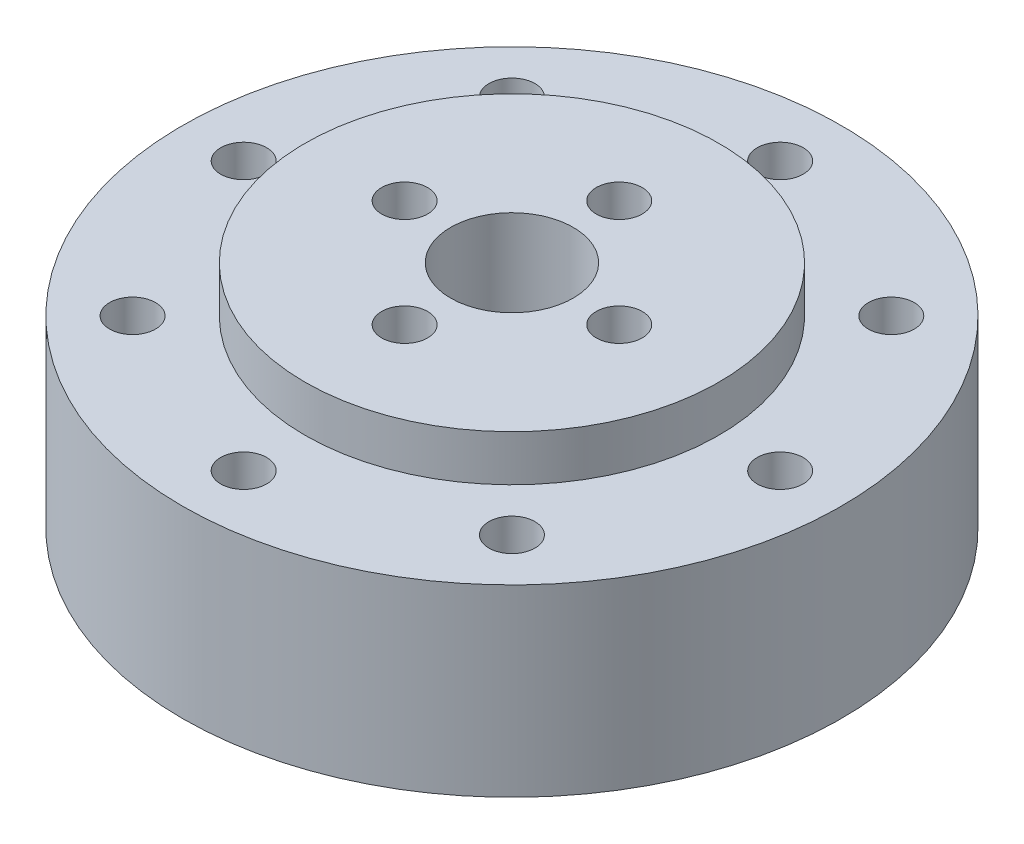
ISO-10303-21;
HEADER;
FILE_DESCRIPTION(('STEP AP214'),'2;1');
FILE_NAME('part.step','',(''),(''),'','','');
FILE_SCHEMA(('AUTOMOTIVE_DESIGN { 1 0 10303 214 1 1 1 1 }'));
ENDSEC;
DATA;
#1=APPLICATION_CONTEXT('core data for automotive mechanical design processes');
#2=APPLICATION_PROTOCOL_DEFINITION('international standard','automotive_design',2000,#1);
#3=PRODUCT_CONTEXT('',#1,'mechanical');
#4=PRODUCT('Part','Part','',(#3));
#5=PRODUCT_RELATED_PRODUCT_CATEGORY('part','',(#4));
#6=PRODUCT_DEFINITION_FORMATION('','',#4);
#7=PRODUCT_DEFINITION_CONTEXT('part definition',#1,'design');
#8=PRODUCT_DEFINITION('design','',#6,#7);
#9=PRODUCT_DEFINITION_SHAPE('','',#8);
#10=(LENGTH_UNIT() NAMED_UNIT(*) SI_UNIT(.MILLI.,.METRE.));
#11=(NAMED_UNIT(*) PLANE_ANGLE_UNIT() SI_UNIT($,.RADIAN.));
#12=(NAMED_UNIT(*) SI_UNIT($,.STERADIAN.) SOLID_ANGLE_UNIT());
#13=UNCERTAINTY_MEASURE_WITH_UNIT(LENGTH_MEASURE(1.E-05),#10,'distance_accuracy_value','');
#14=(GEOMETRIC_REPRESENTATION_CONTEXT(3) GLOBAL_UNCERTAINTY_ASSIGNED_CONTEXT((#13)) GLOBAL_UNIT_ASSIGNED_CONTEXT((#10,
#11,#12)) REPRESENTATION_CONTEXT('',''));
#15=CARTESIAN_POINT('',(0.,0.,0.));
#16=DIRECTION('',(0.,0.,1.));
#17=DIRECTION('',(1.,0.,0.));
#18=AXIS2_PLACEMENT_3D('',#15,#16,#17);
#19=CARTESIAN_POINT('',(0.,12.,0.));
#20=DIRECTION('',(0.,1.,0.));
#21=DIRECTION('',(0.,0.,1.));
#22=AXIS2_PLACEMENT_3D('',#19,#20,#21);
#23=PLANE('',#22);
#24=CARTESIAN_POINT('',(-17.5,12.,0.));
#25=DIRECTION('',(0.,1.,0.));
#26=DIRECTION('',(0.,0.,1.));
#27=AXIS2_PLACEMENT_3D('',#24,#25,#26);
#28=CIRCLE('',#27,1.49999999999999);
#29=CARTESIAN_POINT('',(-17.5,12.,1.49999999999993));
#30=VERTEX_POINT('',#29);
#31=EDGE_CURVE('E245',#30,#30,#28,.F.);
#32=ORIENTED_EDGE('',*,*,#31,.T.);
#33=EDGE_LOOP('',(#32));
#34=FACE_BOUND('',#33,.T.);
#35=CARTESIAN_POINT('',(-12.3743686707646,12.,12.3743686707646));
#36=DIRECTION('',(0.,1.,0.));
#37=DIRECTION('',(0.,0.,1.));
#38=AXIS2_PLACEMENT_3D('',#35,#36,#37);
#39=CIRCLE('',#38,1.5);
#40=CARTESIAN_POINT('',(-12.3743686707646,12.,13.8743686707646));
#41=VERTEX_POINT('',#40);
#42=EDGE_CURVE('E262',#41,#41,#39,.F.);
#43=ORIENTED_EDGE('',*,*,#42,.T.);
#44=EDGE_LOOP('',(#43));
#45=FACE_BOUND('',#44,.T.);
#46=CARTESIAN_POINT('',(12.3743686707646,12.,-12.3743686707646));
#47=DIRECTION('',(0.,1.,0.));
#48=DIRECTION('',(0.,0.,1.));
#49=AXIS2_PLACEMENT_3D('',#46,#47,#48);
#50=CIRCLE('',#49,1.5);
#51=CARTESIAN_POINT('',(12.3743686707646,12.,-10.8743686707646));
#52=VERTEX_POINT('',#51);
#53=EDGE_CURVE('E260',#52,#52,#50,.F.);
#54=ORIENTED_EDGE('',*,*,#53,.T.);
#55=EDGE_LOOP('',(#54));
#56=FACE_BOUND('',#55,.T.);
#57=CARTESIAN_POINT('',(-12.3743686707646,12.,-12.3743686707646));
#58=DIRECTION('',(0.,1.,0.));
#59=DIRECTION('',(0.,0.,1.));
#60=AXIS2_PLACEMENT_3D('',#57,#58,#59);
#61=CIRCLE('',#60,1.5);
#62=CARTESIAN_POINT('',(-12.3743686707646,12.,-10.8743686707646));
#63=VERTEX_POINT('',#62);
#64=EDGE_CURVE('E263',#63,#63,#61,.F.);
#65=ORIENTED_EDGE('',*,*,#64,.T.);
#66=EDGE_LOOP('',(#65));
#67=FACE_BOUND('',#66,.T.);
#68=CARTESIAN_POINT('',(0.,12.,-17.5));
#69=DIRECTION('',(0.,1.,0.));
#70=DIRECTION('',(0.,0.,1.));
#71=AXIS2_PLACEMENT_3D('',#68,#69,#70);
#72=CIRCLE('',#71,1.5);
#73=CARTESIAN_POINT('',(0.,12.,-16.));
#74=VERTEX_POINT('',#73);
#75=EDGE_CURVE('E268',#74,#74,#72,.F.);
#76=ORIENTED_EDGE('',*,*,#75,.T.);
#77=EDGE_LOOP('',(#76));
#78=FACE_BOUND('',#77,.T.);
#79=CARTESIAN_POINT('',(0.,12.,17.5));
#80=DIRECTION('',(0.,1.,0.));
#81=DIRECTION('',(0.,0.,1.));
#82=AXIS2_PLACEMENT_3D('',#79,#80,#81);
#83=CIRCLE('',#82,1.5);
#84=CARTESIAN_POINT('',(0.,12.,19.));
#85=VERTEX_POINT('',#84);
#86=EDGE_CURVE('E500',#85,#85,#83,.F.);
#87=ORIENTED_EDGE('',*,*,#86,.T.);
#88=EDGE_LOOP('',(#87));
#89=FACE_BOUND('',#88,.T.);
#90=CARTESIAN_POINT('',(12.3743686707646,12.,12.3743686707646));
#91=DIRECTION('',(0.,1.,0.));
#92=DIRECTION('',(0.,0.,1.));
#93=AXIS2_PLACEMENT_3D('',#90,#91,#92);
#94=CIRCLE('',#93,1.5);
#95=CARTESIAN_POINT('',(12.3743686707646,12.,13.8743686707646));
#96=VERTEX_POINT('',#95);
#97=EDGE_CURVE('E497',#96,#96,#94,.F.);
#98=ORIENTED_EDGE('',*,*,#97,.T.);
#99=EDGE_LOOP('',(#98));
#100=FACE_BOUND('',#99,.T.);
#101=CARTESIAN_POINT('',(0.,12.,0.));
#102=DIRECTION('',(0.,1.,0.));
#103=DIRECTION('',(0.,0.,1.));
#104=AXIS2_PLACEMENT_3D('',#101,#102,#103);
#105=CIRCLE('',#104,21.5);
#106=CARTESIAN_POINT('',(0.,12.,21.5));
#107=VERTEX_POINT('',#106);
#108=EDGE_CURVE('E494',#107,#107,#105,.T.);
#109=ORIENTED_EDGE('',*,*,#108,.T.);
#110=EDGE_LOOP('',(#109));
#111=FACE_BOUND('',#110,.T.);
#112=CARTESIAN_POINT('',(17.5,12.,0.));
#113=DIRECTION('',(0.,1.,0.));
#114=DIRECTION('',(0.,0.,1.));
#115=AXIS2_PLACEMENT_3D('',#112,#113,#114);
#116=CIRCLE('',#115,1.5);
#117=CARTESIAN_POINT('',(17.5,12.,1.5));
#118=VERTEX_POINT('',#117);
#119=EDGE_CURVE('E290',#118,#118,#116,.F.);
#120=ORIENTED_EDGE('',*,*,#119,.T.);
#121=EDGE_LOOP('',(#120));
#122=FACE_BOUND('',#121,.T.);
#123=CARTESIAN_POINT('',(0.,12.,0.));
#124=DIRECTION('',(0.,1.,0.));
#125=DIRECTION('',(0.,0.,1.));
#126=AXIS2_PLACEMENT_3D('',#123,#124,#125);
#127=CIRCLE('',#126,13.5);
#128=CARTESIAN_POINT('',(0.,12.,13.5));
#129=VERTEX_POINT('',#128);
#130=EDGE_CURVE('E488',#129,#129,#127,.T.);
#131=ORIENTED_EDGE('',*,*,#130,.F.);
#132=EDGE_LOOP('',(#131));
#133=FACE_BOUND('',#132,.T.);
#134=ADVANCED_FACE('F43',(#34,#45,#56,#67,#78,#89,#100,#111,#122,#133),#23,.T.);
#135=CARTESIAN_POINT('',(0.,0.,0.));
#136=DIRECTION('',(0.,1.,0.));
#137=DIRECTION('',(0.,0.,1.));
#138=AXIS2_PLACEMENT_3D('',#135,#136,#137);
#139=PLANE('',#138);
#140=CARTESIAN_POINT('',(0.,0.,0.));
#141=DIRECTION('',(0.,1.,0.));
#142=DIRECTION('',(0.,0.,1.));
#143=AXIS2_PLACEMENT_3D('',#140,#141,#142);
#144=CIRCLE('',#143,21.5);
#145=CARTESIAN_POINT('',(0.,0.,21.5));
#146=VERTEX_POINT('',#145);
#147=EDGE_CURVE('E11',#146,#146,#144,.T.);
#148=ORIENTED_EDGE('',*,*,#147,.F.);
#149=EDGE_LOOP('',(#148));
#150=FACE_BOUND('',#149,.T.);
#151=CARTESIAN_POINT('',(12.3743686707646,0.,-12.3743686707646));
#152=DIRECTION('',(0.,1.,0.));
#153=DIRECTION('',(0.,0.,1.));
#154=AXIS2_PLACEMENT_3D('',#151,#152,#153);
#155=CIRCLE('',#154,1.5);
#156=CARTESIAN_POINT('',(12.3743686707646,0.,-10.8743686707646));
#157=VERTEX_POINT('',#156);
#158=EDGE_CURVE('E52',#157,#157,#155,.T.);
#159=ORIENTED_EDGE('',*,*,#158,.T.);
#160=EDGE_LOOP('',(#159));
#161=FACE_BOUND('',#160,.T.);
#162=CARTESIAN_POINT('',(0.,0.,0.));
#163=DIRECTION('',(0.,1.,0.));
#164=DIRECTION('',(0.,0.,1.));
#165=AXIS2_PLACEMENT_3D('',#162,#163,#164);
#166=CIRCLE('',#165,10.);
#167=CARTESIAN_POINT('',(0.,0.,10.));
#168=VERTEX_POINT('',#167);
#169=EDGE_CURVE('E242',#168,#168,#166,.T.);
#170=ORIENTED_EDGE('',*,*,#169,.T.);
#171=EDGE_LOOP('',(#170));
#172=FACE_BOUND('',#171,.T.);
#173=CARTESIAN_POINT('',(12.3743686707646,0.,12.3743686707646));
#174=DIRECTION('',(0.,1.,0.));
#175=DIRECTION('',(0.,0.,-1.));
#176=AXIS2_PLACEMENT_3D('',#173,#174,#175);
#177=CIRCLE('',#176,1.5);
#178=CARTESIAN_POINT('',(12.3743686707646,0.,10.8743686707646));
#179=VERTEX_POINT('',#178);
#180=EDGE_CURVE('E239',#179,#179,#177,.T.);
#181=ORIENTED_EDGE('',*,*,#180,.T.);
#182=EDGE_LOOP('',(#181));
#183=FACE_BOUND('',#182,.T.);
#184=CARTESIAN_POINT('',(-12.3743686707646,0.,12.3743686707646));
#185=DIRECTION('',(0.,1.,0.));
#186=DIRECTION('',(0.,0.,1.));
#187=AXIS2_PLACEMENT_3D('',#184,#185,#186);
#188=CIRCLE('',#187,1.5);
#189=CARTESIAN_POINT('',(-12.3743686707646,0.,13.8743686707646));
#190=VERTEX_POINT('',#189);
#191=EDGE_CURVE('E236',#190,#190,#188,.T.);
#192=ORIENTED_EDGE('',*,*,#191,.T.);
#193=EDGE_LOOP('',(#192));
#194=FACE_BOUND('',#193,.T.);
#195=CARTESIAN_POINT('',(-12.3743686707646,0.,-12.3743686707646));
#196=DIRECTION('',(0.,1.,0.));
#197=DIRECTION('',(0.,0.,-1.));
#198=AXIS2_PLACEMENT_3D('',#195,#196,#197);
#199=CIRCLE('',#198,1.5);
#200=CARTESIAN_POINT('',(-12.3743686707646,0.,-13.8743686707646));
#201=VERTEX_POINT('',#200);
#202=EDGE_CURVE('E233',#201,#201,#199,.T.);
#203=ORIENTED_EDGE('',*,*,#202,.T.);
#204=EDGE_LOOP('',(#203));
#205=FACE_BOUND('',#204,.T.);
#206=CARTESIAN_POINT('',(17.5,0.,0.));
#207=DIRECTION('',(0.,1.,0.));
#208=DIRECTION('',(0.,0.,1.));
#209=AXIS2_PLACEMENT_3D('',#206,#207,#208);
#210=CIRCLE('',#209,1.5);
#211=CARTESIAN_POINT('',(17.5,0.,1.5));
#212=VERTEX_POINT('',#211);
#213=EDGE_CURVE('E230',#212,#212,#210,.T.);
#214=ORIENTED_EDGE('',*,*,#213,.T.);
#215=EDGE_LOOP('',(#214));
#216=FACE_BOUND('',#215,.T.);
#217=CARTESIAN_POINT('',(0.,0.,17.5));
#218=DIRECTION('',(0.,1.,0.));
#219=DIRECTION('',(0.,0.,-1.));
#220=AXIS2_PLACEMENT_3D('',#217,#218,#219);
#221=CIRCLE('',#220,1.5);
#222=CARTESIAN_POINT('',(0.,0.,16.));
#223=VERTEX_POINT('',#222);
#224=EDGE_CURVE('E227',#223,#223,#221,.T.);
#225=ORIENTED_EDGE('',*,*,#224,.T.);
#226=EDGE_LOOP('',(#225));
#227=FACE_BOUND('',#226,.T.);
#228=CARTESIAN_POINT('',(-17.5,0.,0.));
#229=DIRECTION('',(0.,1.,0.));
#230=DIRECTION('',(0.,0.,1.));
#231=AXIS2_PLACEMENT_3D('',#228,#229,#230);
#232=CIRCLE('',#231,1.49999999999999);
#233=CARTESIAN_POINT('',(-17.5,0.,1.49999999999993));
#234=VERTEX_POINT('',#233);
#235=EDGE_CURVE('E224',#234,#234,#232,.T.);
#236=ORIENTED_EDGE('',*,*,#235,.T.);
#237=EDGE_LOOP('',(#236));
#238=FACE_BOUND('',#237,.T.);
#239=CARTESIAN_POINT('',(0.,0.,-17.5));
#240=DIRECTION('',(0.,1.,0.));
#241=DIRECTION('',(0.,0.,-1.));
#242=AXIS2_PLACEMENT_3D('',#239,#240,#241);
#243=CIRCLE('',#242,1.5);
#244=CARTESIAN_POINT('',(0.,0.,-19.));
#245=VERTEX_POINT('',#244);
#246=EDGE_CURVE('E221',#245,#245,#243,.T.);
#247=ORIENTED_EDGE('',*,*,#246,.T.);
#248=EDGE_LOOP('',(#247));
#249=FACE_BOUND('',#248,.T.);
#250=ADVANCED_FACE('F250',(#150,#161,#172,#183,#194,#205,#216,#227,#238,#249),#139,.F.);
#251=CARTESIAN_POINT('',(0.,9.,0.));
#252=DIRECTION('',(0.,-1.,0.));
#253=DIRECTION('',(0.,0.,-1.));
#254=AXIS2_PLACEMENT_3D('',#251,#252,#253);
#255=CYLINDRICAL_SURFACE('',#254,21.5);
#256=ORIENTED_EDGE('',*,*,#147,.T.);
#257=EDGE_LOOP('',(#256));
#258=FACE_BOUND('',#257,.T.);
#259=ORIENTED_EDGE('',*,*,#108,.F.);
#260=EDGE_LOOP('',(#259));
#261=FACE_BOUND('',#260,.T.);
#262=ADVANCED_FACE('F45',(#258,#261),#255,.T.);
#263=CARTESIAN_POINT('',(12.3743686707646,9.,-12.3743686707646));
#264=DIRECTION('',(0.,-1.,0.));
#265=DIRECTION('',(0.,0.,-1.));
#266=AXIS2_PLACEMENT_3D('',#263,#264,#265);
#267=CYLINDRICAL_SURFACE('',#266,1.5);
#268=ORIENTED_EDGE('',*,*,#158,.F.);
#269=EDGE_LOOP('',(#268));
#270=FACE_BOUND('',#269,.T.);
#271=ORIENTED_EDGE('',*,*,#53,.F.);
#272=EDGE_LOOP('',(#271));
#273=FACE_BOUND('',#272,.T.);
#274=ADVANCED_FACE('F253',(#270,#273),#267,.F.);
#275=CARTESIAN_POINT('',(0.,9.,0.));
#276=DIRECTION('',(0.,-1.,0.));
#277=DIRECTION('',(0.,0.,-1.));
#278=AXIS2_PLACEMENT_3D('',#275,#276,#277);
#279=CYLINDRICAL_SURFACE('',#278,10.);
#280=CARTESIAN_POINT('',(0.,9.,0.));
#281=DIRECTION('',(0.,1.,0.));
#282=DIRECTION('',(0.,0.,1.));
#283=AXIS2_PLACEMENT_3D('',#280,#281,#282);
#284=CIRCLE('',#283,10.);
#285=CARTESIAN_POINT('',(0.,9.,10.));
#286=VERTEX_POINT('',#285);
#287=EDGE_CURVE('E188',#286,#286,#284,.T.);
#288=ORIENTED_EDGE('',*,*,#287,.T.);
#289=EDGE_LOOP('',(#288));
#290=FACE_BOUND('',#289,.T.);
#291=ORIENTED_EDGE('',*,*,#169,.F.);
#292=EDGE_LOOP('',(#291));
#293=FACE_BOUND('',#292,.T.);
#294=ADVANCED_FACE('F256',(#290,#293),#279,.F.);
#295=CARTESIAN_POINT('',(12.3743686707646,9.,12.3743686707646));
#296=DIRECTION('',(0.,-1.,0.));
#297=DIRECTION('',(0.,0.,-1.));
#298=AXIS2_PLACEMENT_3D('',#295,#296,#297);
#299=CYLINDRICAL_SURFACE('',#298,1.5);
#300=ORIENTED_EDGE('',*,*,#180,.F.);
#301=EDGE_LOOP('',(#300));
#302=FACE_BOUND('',#301,.T.);
#303=ORIENTED_EDGE('',*,*,#97,.F.);
#304=EDGE_LOOP('',(#303));
#305=FACE_BOUND('',#304,.T.);
#306=ADVANCED_FACE('F538',(#302,#305),#299,.F.);
#307=CARTESIAN_POINT('',(-12.3743686707646,9.,12.3743686707646));
#308=DIRECTION('',(0.,-1.,0.));
#309=DIRECTION('',(0.,0.,-1.));
#310=AXIS2_PLACEMENT_3D('',#307,#308,#309);
#311=CYLINDRICAL_SURFACE('',#310,1.5);
#312=ORIENTED_EDGE('',*,*,#191,.F.);
#313=EDGE_LOOP('',(#312));
#314=FACE_BOUND('',#313,.T.);
#315=ORIENTED_EDGE('',*,*,#42,.F.);
#316=EDGE_LOOP('',(#315));
#317=FACE_BOUND('',#316,.T.);
#318=ADVANCED_FACE('F530',(#314,#317),#311,.F.);
#319=CARTESIAN_POINT('',(-12.3743686707646,9.,-12.3743686707646));
#320=DIRECTION('',(0.,-1.,0.));
#321=DIRECTION('',(0.,0.,-1.));
#322=AXIS2_PLACEMENT_3D('',#319,#320,#321);
#323=CYLINDRICAL_SURFACE('',#322,1.5);
#324=ORIENTED_EDGE('',*,*,#202,.F.);
#325=EDGE_LOOP('',(#324));
#326=FACE_BOUND('',#325,.T.);
#327=ORIENTED_EDGE('',*,*,#64,.F.);
#328=EDGE_LOOP('',(#327));
#329=FACE_BOUND('',#328,.T.);
#330=ADVANCED_FACE('F521',(#326,#329),#323,.F.);
#331=CARTESIAN_POINT('',(17.5,9.,0.));
#332=DIRECTION('',(0.,-1.,0.));
#333=DIRECTION('',(0.,0.,-1.));
#334=AXIS2_PLACEMENT_3D('',#331,#332,#333);
#335=CYLINDRICAL_SURFACE('',#334,1.5);
#336=ORIENTED_EDGE('',*,*,#213,.F.);
#337=EDGE_LOOP('',(#336));
#338=FACE_BOUND('',#337,.T.);
#339=ORIENTED_EDGE('',*,*,#119,.F.);
#340=EDGE_LOOP('',(#339));
#341=FACE_BOUND('',#340,.T.);
#342=ADVANCED_FACE('F518',(#338,#341),#335,.F.);
#343=CARTESIAN_POINT('',(0.,9.,17.5));
#344=DIRECTION('',(0.,-1.,0.));
#345=DIRECTION('',(0.,0.,-1.));
#346=AXIS2_PLACEMENT_3D('',#343,#344,#345);
#347=CYLINDRICAL_SURFACE('',#346,1.5);
#348=ORIENTED_EDGE('',*,*,#224,.F.);
#349=EDGE_LOOP('',(#348));
#350=FACE_BOUND('',#349,.T.);
#351=ORIENTED_EDGE('',*,*,#86,.F.);
#352=EDGE_LOOP('',(#351));
#353=FACE_BOUND('',#352,.T.);
#354=ADVANCED_FACE('F520',(#350,#353),#347,.F.);
#355=CARTESIAN_POINT('',(-17.5,9.,0.));
#356=DIRECTION('',(0.,-1.,0.));
#357=DIRECTION('',(0.,0.,-1.));
#358=AXIS2_PLACEMENT_3D('',#355,#356,#357);
#359=CYLINDRICAL_SURFACE('',#358,1.49999999999999);
#360=ORIENTED_EDGE('',*,*,#235,.F.);
#361=EDGE_LOOP('',(#360));
#362=FACE_BOUND('',#361,.T.);
#363=ORIENTED_EDGE('',*,*,#31,.F.);
#364=EDGE_LOOP('',(#363));
#365=FACE_BOUND('',#364,.T.);
#366=ADVANCED_FACE('F434',(#362,#365),#359,.F.);
#367=CARTESIAN_POINT('',(0.,9.,-17.5));
#368=DIRECTION('',(0.,-1.,0.));
#369=DIRECTION('',(0.,0.,-1.));
#370=AXIS2_PLACEMENT_3D('',#367,#368,#369);
#371=CYLINDRICAL_SURFACE('',#370,1.5);
#372=ORIENTED_EDGE('',*,*,#246,.F.);
#373=EDGE_LOOP('',(#372));
#374=FACE_BOUND('',#373,.T.);
#375=ORIENTED_EDGE('',*,*,#75,.F.);
#376=EDGE_LOOP('',(#375));
#377=FACE_BOUND('',#376,.T.);
#378=ADVANCED_FACE('F425',(#374,#377),#371,.F.);
#379=CARTESIAN_POINT('',(0.,9.,0.));
#380=DIRECTION('',(0.,1.,0.));
#381=DIRECTION('',(0.,0.,1.));
#382=AXIS2_PLACEMENT_3D('',#379,#380,#381);
#383=PLANE('',#382);
#384=CARTESIAN_POINT('',(-7.,9.,0.));
#385=DIRECTION('',(0.,1.,0.));
#386=DIRECTION('',(0.,0.,1.));
#387=AXIS2_PLACEMENT_3D('',#384,#385,#386);
#388=CIRCLE('',#387,1.5);
#389=CARTESIAN_POINT('',(-7.,9.,1.5));
#390=VERTEX_POINT('',#389);
#391=EDGE_CURVE('E287',#390,#390,#388,.F.);
#392=ORIENTED_EDGE('',*,*,#391,.F.);
#393=EDGE_LOOP('',(#392));
#394=FACE_BOUND('',#393,.T.);
#395=CARTESIAN_POINT('',(0.,9.,-7.));
#396=DIRECTION('',(0.,1.,0.));
#397=DIRECTION('',(0.,0.,1.));
#398=AXIS2_PLACEMENT_3D('',#395,#396,#397);
#399=CIRCLE('',#398,1.5);
#400=CARTESIAN_POINT('',(0.,9.,-5.5));
#401=VERTEX_POINT('',#400);
#402=EDGE_CURVE('E284',#401,#401,#399,.T.);
#403=ORIENTED_EDGE('',*,*,#402,.T.);
#404=EDGE_LOOP('',(#403));
#405=FACE_BOUND('',#404,.T.);
#406=CARTESIAN_POINT('',(7.,9.,0.));
#407=DIRECTION('',(0.,1.,0.));
#408=DIRECTION('',(0.,0.,1.));
#409=AXIS2_PLACEMENT_3D('',#406,#407,#408);
#410=CIRCLE('',#409,1.5);
#411=CARTESIAN_POINT('',(7.,9.,1.5));
#412=VERTEX_POINT('',#411);
#413=EDGE_CURVE('E281',#412,#412,#410,.T.);
#414=ORIENTED_EDGE('',*,*,#413,.T.);
#415=EDGE_LOOP('',(#414));
#416=FACE_BOUND('',#415,.T.);
#417=CARTESIAN_POINT('',(0.,9.,7.));
#418=DIRECTION('',(0.,1.,0.));
#419=DIRECTION('',(0.,0.,1.));
#420=AXIS2_PLACEMENT_3D('',#417,#418,#419);
#421=CIRCLE('',#420,1.5);
#422=CARTESIAN_POINT('',(0.,9.,8.5));
#423=VERTEX_POINT('',#422);
#424=EDGE_CURVE('E277',#423,#423,#421,.F.);
#425=ORIENTED_EDGE('',*,*,#424,.F.);
#426=EDGE_LOOP('',(#425));
#427=FACE_BOUND('',#426,.T.);
#428=CARTESIAN_POINT('',(0.,9.,0.));
#429=DIRECTION('',(0.,1.,0.));
#430=DIRECTION('',(0.,0.,1.));
#431=AXIS2_PLACEMENT_3D('',#428,#429,#430);
#432=CIRCLE('',#431,4.);
#433=CARTESIAN_POINT('',(0.,9.,4.));
#434=VERTEX_POINT('',#433);
#435=EDGE_CURVE('E274',#434,#434,#432,.T.);
#436=ORIENTED_EDGE('',*,*,#435,.T.);
#437=EDGE_LOOP('',(#436));
#438=FACE_BOUND('',#437,.T.);
#439=ORIENTED_EDGE('',*,*,#287,.F.);
#440=EDGE_LOOP('',(#439));
#441=FACE_BOUND('',#440,.T.);
#442=ADVANCED_FACE('F414',(#394,#405,#416,#427,#438,#441),#383,.F.);
#443=CARTESIAN_POINT('',(0.,12.,-7.));
#444=DIRECTION('',(0.,-1.,0.));
#445=DIRECTION('',(0.,0.,-1.));
#446=AXIS2_PLACEMENT_3D('',#443,#444,#445);
#447=CYLINDRICAL_SURFACE('',#446,1.5);
#448=ORIENTED_EDGE('',*,*,#402,.F.);
#449=EDGE_LOOP('',(#448));
#450=FACE_BOUND('',#449,.T.);
#451=CARTESIAN_POINT('',(0.,15.,-7.));
#452=DIRECTION('',(0.,1.,0.));
#453=DIRECTION('',(0.,0.,1.));
#454=AXIS2_PLACEMENT_3D('',#451,#452,#453);
#455=CIRCLE('',#454,1.5);
#456=CARTESIAN_POINT('',(0.,15.,-5.5));
#457=VERTEX_POINT('',#456);
#458=EDGE_CURVE('E480',#457,#457,#455,.T.);
#459=ORIENTED_EDGE('',*,*,#458,.T.);
#460=EDGE_LOOP('',(#459));
#461=FACE_BOUND('',#460,.T.);
#462=ADVANCED_FACE('F424',(#450,#461),#447,.F.);
#463=CARTESIAN_POINT('',(7.,12.,0.));
#464=DIRECTION('',(0.,-1.,0.));
#465=DIRECTION('',(0.,0.,-1.));
#466=AXIS2_PLACEMENT_3D('',#463,#464,#465);
#467=CYLINDRICAL_SURFACE('',#466,1.5);
#468=ORIENTED_EDGE('',*,*,#413,.F.);
#469=EDGE_LOOP('',(#468));
#470=FACE_BOUND('',#469,.T.);
#471=CARTESIAN_POINT('',(7.,15.,0.));
#472=DIRECTION('',(0.,1.,0.));
#473=DIRECTION('',(0.,0.,1.));
#474=AXIS2_PLACEMENT_3D('',#471,#472,#473);
#475=CIRCLE('',#474,1.5);
#476=CARTESIAN_POINT('',(7.,15.,1.5));
#477=VERTEX_POINT('',#476);
#478=EDGE_CURVE('E477',#477,#477,#475,.T.);
#479=ORIENTED_EDGE('',*,*,#478,.T.);
#480=EDGE_LOOP('',(#479));
#481=FACE_BOUND('',#480,.T.);
#482=ADVANCED_FACE('F431',(#470,#481),#467,.F.);
#483=CARTESIAN_POINT('',(0.,12.,7.));
#484=DIRECTION('',(0.,-1.,0.));
#485=DIRECTION('',(0.,0.,-1.));
#486=AXIS2_PLACEMENT_3D('',#483,#484,#485);
#487=CYLINDRICAL_SURFACE('',#486,1.5);
#488=ORIENTED_EDGE('',*,*,#424,.T.);
#489=EDGE_LOOP('',(#488));
#490=FACE_BOUND('',#489,.T.);
#491=CARTESIAN_POINT('',(0.,15.,7.));
#492=DIRECTION('',(0.,1.,0.));
#493=DIRECTION('',(0.,0.,1.));
#494=AXIS2_PLACEMENT_3D('',#491,#492,#493);
#495=CIRCLE('',#494,1.5);
#496=CARTESIAN_POINT('',(0.,15.,8.5));
#497=VERTEX_POINT('',#496);
#498=EDGE_CURVE('E466',#497,#497,#495,.T.);
#499=ORIENTED_EDGE('',*,*,#498,.T.);
#500=EDGE_LOOP('',(#499));
#501=FACE_BOUND('',#500,.T.);
#502=ADVANCED_FACE('F717',(#490,#501),#487,.F.);
#503=CARTESIAN_POINT('',(0.,12.,0.));
#504=DIRECTION('',(0.,-1.,0.));
#505=DIRECTION('',(0.,0.,-1.));
#506=AXIS2_PLACEMENT_3D('',#503,#504,#505);
#507=CYLINDRICAL_SURFACE('',#506,4.);
#508=ORIENTED_EDGE('',*,*,#435,.F.);
#509=EDGE_LOOP('',(#508));
#510=FACE_BOUND('',#509,.T.);
#511=CARTESIAN_POINT('',(0.,15.,0.));
#512=DIRECTION('',(0.,1.,0.));
#513=DIRECTION('',(0.,0.,1.));
#514=AXIS2_PLACEMENT_3D('',#511,#512,#513);
#515=CIRCLE('',#514,4.);
#516=CARTESIAN_POINT('',(0.,15.,4.));
#517=VERTEX_POINT('',#516);
#518=EDGE_CURVE('E462',#517,#517,#515,.T.);
#519=ORIENTED_EDGE('',*,*,#518,.T.);
#520=EDGE_LOOP('',(#519));
#521=FACE_BOUND('',#520,.T.);
#522=ADVANCED_FACE('F457',(#510,#521),#507,.F.);
#523=CARTESIAN_POINT('',(-7.,12.,0.));
#524=DIRECTION('',(0.,-1.,0.));
#525=DIRECTION('',(0.,0.,-1.));
#526=AXIS2_PLACEMENT_3D('',#523,#524,#525);
#527=CYLINDRICAL_SURFACE('',#526,1.5);
#528=ORIENTED_EDGE('',*,*,#391,.T.);
#529=EDGE_LOOP('',(#528));
#530=FACE_BOUND('',#529,.T.);
#531=CARTESIAN_POINT('',(-7.,15.,0.));
#532=DIRECTION('',(0.,1.,0.));
#533=DIRECTION('',(0.,0.,1.));
#534=AXIS2_PLACEMENT_3D('',#531,#532,#533);
#535=CIRCLE('',#534,1.5);
#536=CARTESIAN_POINT('',(-7.,15.,1.5));
#537=VERTEX_POINT('',#536);
#538=EDGE_CURVE('E473',#537,#537,#535,.T.);
#539=ORIENTED_EDGE('',*,*,#538,.T.);
#540=EDGE_LOOP('',(#539));
#541=FACE_BOUND('',#540,.T.);
#542=ADVANCED_FACE('F452',(#530,#541),#527,.F.);
#543=CARTESIAN_POINT('',(0.,15.,0.));
#544=DIRECTION('',(0.,1.,0.));
#545=DIRECTION('',(0.,0.,1.));
#546=AXIS2_PLACEMENT_3D('',#543,#544,#545);
#547=PLANE('',#546);
#548=ORIENTED_EDGE('',*,*,#518,.F.);
#549=EDGE_LOOP('',(#548));
#550=FACE_BOUND('',#549,.T.);
#551=ORIENTED_EDGE('',*,*,#498,.F.);
#552=EDGE_LOOP('',(#551));
#553=FACE_BOUND('',#552,.T.);
#554=CARTESIAN_POINT('',(0.,15.,0.));
#555=DIRECTION('',(0.,1.,0.));
#556=DIRECTION('',(0.,0.,1.));
#557=AXIS2_PLACEMENT_3D('',#554,#555,#556);
#558=CIRCLE('',#557,13.5);
#559=CARTESIAN_POINT('',(0.,15.,13.5));
#560=VERTEX_POINT('',#559);
#561=EDGE_CURVE('E278',#560,#560,#558,.T.);
#562=ORIENTED_EDGE('',*,*,#561,.T.);
#563=EDGE_LOOP('',(#562));
#564=FACE_BOUND('',#563,.T.);
#565=ORIENTED_EDGE('',*,*,#538,.F.);
#566=EDGE_LOOP('',(#565));
#567=FACE_BOUND('',#566,.T.);
#568=ORIENTED_EDGE('',*,*,#478,.F.);
#569=EDGE_LOOP('',(#568));
#570=FACE_BOUND('',#569,.T.);
#571=ORIENTED_EDGE('',*,*,#458,.F.);
#572=EDGE_LOOP('',(#571));
#573=FACE_BOUND('',#572,.T.);
#574=ADVANCED_FACE('F449',(#550,#553,#564,#567,#570,#573),#547,.T.);
#575=CARTESIAN_POINT('',(0.,15.,0.));
#576=DIRECTION('',(0.,-1.,0.));
#577=DIRECTION('',(0.,0.,-1.));
#578=AXIS2_PLACEMENT_3D('',#575,#576,#577);
#579=CYLINDRICAL_SURFACE('',#578,13.5);
#580=ORIENTED_EDGE('',*,*,#561,.F.);
#581=EDGE_LOOP('',(#580));
#582=FACE_BOUND('',#581,.T.);
#583=ORIENTED_EDGE('',*,*,#130,.T.);
#584=EDGE_LOOP('',(#583));
#585=FACE_BOUND('',#584,.T.);
#586=ADVANCED_FACE('F447',(#582,#585),#579,.T.);
#587=CLOSED_SHELL('',(#134,#250,#262,#274,#294,#306,#318,#330,#342,#354,#366,#378,#442,#462,
#482,#502,#522,#542,#574,#586));
#588=CARTESIAN_POINT('',(0.,9.,0.));
#589=DIRECTION('',(0.,1.,0.));
#590=DIRECTION('',(0.,0.,1.));
#591=AXIS2_PLACEMENT_3D('',#588,#589,#590);
#592=CIRCLE('',#591,12.);
#593=CARTESIAN_POINT('',(0.,9.,12.));
#594=VERTEX_POINT('',#593);
#595=EDGE_CURVE('E302',#594,#594,#592,.T.);
#596=ORIENTED_EDGE('',*,*,#595,.T.);
#597=EDGE_LOOP('',(#596));
#598=FACE_BOUND('',#597,.T.);
#599=CARTESIAN_POINT('',(0.,9.,0.));
#600=DIRECTION('',(0.,1.,0.));
#601=DIRECTION('',(0.,0.,1.));
#602=AXIS2_PLACEMENT_3D('',#599,#600,#601);
#603=CIRCLE('',#602,19.5);
#604=CARTESIAN_POINT('',(11.4844674830449,9.,-15.7593466435282));
#605=VERTEX_POINT('',#604);
#606=CARTESIAN_POINT('',(3.02279604313084,9.,-19.2642857142857));
#607=VERTEX_POINT('',#606);
#608=EDGE_CURVE('E157',#605,#607,#603,.T.);
#609=ORIENTED_EDGE('',*,*,#608,.F.);
#610=CARTESIAN_POINT('',(12.3743686707646,9.,-12.3743686707646));
#611=DIRECTION('',(0.,1.,0.));
#612=DIRECTION('',(0.,0.,1.));
#613=AXIS2_PLACEMENT_3D('',#610,#611,#612);
#614=CIRCLE('',#613,3.5);
#615=CARTESIAN_POINT('',(15.7593466435282,9.,-11.4844674830449));
#616=VERTEX_POINT('',#615);
#617=EDGE_CURVE('E301',#605,#616,#614,.T.);
#618=ORIENTED_EDGE('',*,*,#617,.T.);
#619=CARTESIAN_POINT('',(19.2642857142857,9.,-3.02279604313084));
#620=VERTEX_POINT('',#619);
#621=EDGE_CURVE('E59',#620,#616,#603,.T.);
#622=ORIENTED_EDGE('',*,*,#621,.F.);
#623=CARTESIAN_POINT('',(17.5,9.,0.));
#624=DIRECTION('',(0.,1.,0.));
#625=DIRECTION('',(0.,0.,1.));
#626=AXIS2_PLACEMENT_3D('',#623,#624,#625);
#627=CIRCLE('',#626,3.5);
#628=CARTESIAN_POINT('',(19.2642857142857,9.,3.02279604313084));
#629=VERTEX_POINT('',#628);
#630=EDGE_CURVE('E318',#620,#629,#627,.T.);
#631=ORIENTED_EDGE('',*,*,#630,.T.);
#632=CARTESIAN_POINT('',(15.7593466435282,9.,11.4844674830449));
#633=VERTEX_POINT('',#632);
#634=EDGE_CURVE('E171',#633,#629,#603,.T.);
#635=ORIENTED_EDGE('',*,*,#634,.F.);
#636=CARTESIAN_POINT('',(12.3743686707646,9.,12.3743686707646));
#637=DIRECTION('',(0.,1.,0.));
#638=DIRECTION('',(0.,0.,1.));
#639=AXIS2_PLACEMENT_3D('',#636,#637,#638);
#640=CIRCLE('',#639,3.5);
#641=CARTESIAN_POINT('',(11.4844674830449,9.,15.7593466435282));
#642=VERTEX_POINT('',#641);
#643=EDGE_CURVE('E306',#633,#642,#640,.T.);
#644=ORIENTED_EDGE('',*,*,#643,.T.);
#645=CARTESIAN_POINT('',(3.02279604313087,9.,19.2642857142857));
#646=VERTEX_POINT('',#645);
#647=EDGE_CURVE('E342',#646,#642,#603,.T.);
#648=ORIENTED_EDGE('',*,*,#647,.F.);
#649=CARTESIAN_POINT('',(0.,9.,17.5));
#650=DIRECTION('',(0.,1.,0.));
#651=DIRECTION('',(0.,0.,1.));
#652=AXIS2_PLACEMENT_3D('',#649,#650,#651);
#653=CIRCLE('',#652,3.5);
#654=CARTESIAN_POINT('',(-3.02279604313075,9.,19.2642857142857));
#655=VERTEX_POINT('',#654);
#656=EDGE_CURVE('E322',#646,#655,#653,.T.);
#657=ORIENTED_EDGE('',*,*,#656,.T.);
#658=CARTESIAN_POINT('',(-11.4844674830449,9.,15.7593466435282));
#659=VERTEX_POINT('',#658);
#660=EDGE_CURVE('E170',#659,#655,#603,.T.);
#661=ORIENTED_EDGE('',*,*,#660,.F.);
#662=CARTESIAN_POINT('',(-12.3743686707646,9.,12.3743686707646));
#663=DIRECTION('',(0.,1.,0.));
#664=DIRECTION('',(0.,0.,1.));
#665=AXIS2_PLACEMENT_3D('',#662,#663,#664);
#666=CIRCLE('',#665,3.5);
#667=CARTESIAN_POINT('',(-15.7593466435282,9.,11.4844674830449));
#668=VERTEX_POINT('',#667);
#669=EDGE_CURVE('E310',#659,#668,#666,.T.);
#670=ORIENTED_EDGE('',*,*,#669,.T.);
#671=CARTESIAN_POINT('',(-19.2642857142857,9.,3.02279604313073));
#672=VERTEX_POINT('',#671);
#673=EDGE_CURVE('E179',#672,#668,#603,.T.);
#674=ORIENTED_EDGE('',*,*,#673,.F.);
#675=CARTESIAN_POINT('',(-17.5,9.,0.));
#676=DIRECTION('',(0.,1.,0.));
#677=DIRECTION('',(0.,0.,1.));
#678=AXIS2_PLACEMENT_3D('',#675,#676,#677);
#679=CIRCLE('',#678,3.49999999999999);
#680=CARTESIAN_POINT('',(-19.2642857142857,9.,-3.02279604313087));
#681=VERTEX_POINT('',#680);
#682=EDGE_CURVE('E186',#672,#681,#679,.T.);
#683=ORIENTED_EDGE('',*,*,#682,.T.);
#684=CARTESIAN_POINT('',(-15.7593466435282,9.,-11.4844674830449));
#685=VERTEX_POINT('',#684);
#686=EDGE_CURVE('E294',#685,#681,#603,.T.);
#687=ORIENTED_EDGE('',*,*,#686,.F.);
#688=CARTESIAN_POINT('',(-12.3743686707646,9.,-12.3743686707646));
#689=DIRECTION('',(0.,1.,0.));
#690=DIRECTION('',(0.,0.,1.));
#691=AXIS2_PLACEMENT_3D('',#688,#689,#690);
#692=CIRCLE('',#691,3.5);
#693=CARTESIAN_POINT('',(-11.4844674830449,9.,-15.7593466435282));
#694=VERTEX_POINT('',#693);
#695=EDGE_CURVE('E314',#685,#694,#692,.T.);
#696=ORIENTED_EDGE('',*,*,#695,.T.);
#697=CARTESIAN_POINT('',(-3.02279604313084,9.,-19.2642857142857));
#698=VERTEX_POINT('',#697);
#699=EDGE_CURVE('E168',#698,#694,#603,.T.);
#700=ORIENTED_EDGE('',*,*,#699,.F.);
#701=CARTESIAN_POINT('',(0.,9.,-17.5));
#702=DIRECTION('',(0.,1.,0.));
#703=DIRECTION('',(0.,0.,1.));
#704=AXIS2_PLACEMENT_3D('',#701,#702,#703);
#705=CIRCLE('',#704,3.5);
#706=EDGE_CURVE('E175',#698,#607,#705,.T.);
#707=ORIENTED_EDGE('',*,*,#706,.T.);
#708=EDGE_LOOP('',(#609,#618,#622,#631,#635,#644,#648,#657,#661,#670,#674,#683,#687,#696,#700,#707));
#709=FACE_BOUND('',#708,.T.);
#710=ADVANCED_FACE('F181',(#598,#709),#383,.F.);
#711=CARTESIAN_POINT('',(0.,9.,0.));
#712=DIRECTION('',(0.,-1.,0.));
#713=DIRECTION('',(0.,0.,-1.));
#714=AXIS2_PLACEMENT_3D('',#711,#712,#713);
#715=CYLINDRICAL_SURFACE('',#714,12.);
#716=ORIENTED_EDGE('',*,*,#595,.F.);
#717=EDGE_LOOP('',(#716));
#718=FACE_BOUND('',#717,.T.);
#719=CARTESIAN_POINT('',(0.,2.,0.));
#720=DIRECTION('',(0.,1.,0.));
#721=DIRECTION('',(0.,0.,1.));
#722=AXIS2_PLACEMENT_3D('',#719,#720,#721);
#723=CIRCLE('',#722,12.);
#724=CARTESIAN_POINT('',(0.,2.,12.));
#725=VERTEX_POINT('',#724);
#726=EDGE_CURVE('E303',#725,#725,#723,.T.);
#727=ORIENTED_EDGE('',*,*,#726,.T.);
#728=EDGE_LOOP('',(#727));
#729=FACE_BOUND('',#728,.T.);
#730=ADVANCED_FACE('F411',(#718,#729),#715,.T.);
#731=CARTESIAN_POINT('',(0.,2.,0.));
#732=DIRECTION('',(0.,1.,0.));
#733=DIRECTION('',(0.,0.,1.));
#734=AXIS2_PLACEMENT_3D('',#731,#732,#733);
#735=PLANE('',#734);
#736=CARTESIAN_POINT('',(0.,2.,0.));
#737=DIRECTION('',(0.,1.,0.));
#738=DIRECTION('',(0.,0.,1.));
#739=AXIS2_PLACEMENT_3D('',#736,#737,#738);
#740=CIRCLE('',#739,19.5);
#741=CARTESIAN_POINT('',(19.2642857142857,2.,-3.02279604313084));
#742=VERTEX_POINT('',#741);
#743=CARTESIAN_POINT('',(15.7593466435282,2.,-11.4844674830449));
#744=VERTEX_POINT('',#743);
#745=EDGE_CURVE('E291',#742,#744,#740,.T.);
#746=ORIENTED_EDGE('',*,*,#745,.T.);
#747=CARTESIAN_POINT('',(12.3743686707646,2.,-12.3743686707646));
#748=DIRECTION('',(0.,1.,0.));
#749=DIRECTION('',(0.,0.,1.));
#750=AXIS2_PLACEMENT_3D('',#747,#748,#749);
#751=CIRCLE('',#750,3.5);
#752=CARTESIAN_POINT('',(11.4844674830449,2.,-15.7593466435282));
#753=VERTEX_POINT('',#752);
#754=EDGE_CURVE('E298',#753,#744,#751,.T.);
#755=ORIENTED_EDGE('',*,*,#754,.F.);
#756=CARTESIAN_POINT('',(3.02279604313084,2.,-19.2642857142857));
#757=VERTEX_POINT('',#756);
#758=EDGE_CURVE('E296',#753,#757,#740,.T.);
#759=ORIENTED_EDGE('',*,*,#758,.T.);
#760=CARTESIAN_POINT('',(0.,2.,-17.5));
#761=DIRECTION('',(0.,1.,0.));
#762=DIRECTION('',(0.,0.,1.));
#763=AXIS2_PLACEMENT_3D('',#760,#761,#762);
#764=CIRCLE('',#763,3.5);
#765=CARTESIAN_POINT('',(-3.02279604313084,2.,-19.2642857142857));
#766=VERTEX_POINT('',#765);
#767=EDGE_CURVE('E178',#766,#757,#764,.T.);
#768=ORIENTED_EDGE('',*,*,#767,.F.);
#769=CARTESIAN_POINT('',(-11.4844674830449,2.,-15.7593466435282));
#770=VERTEX_POINT('',#769);
#771=EDGE_CURVE('E371',#766,#770,#740,.T.);
#772=ORIENTED_EDGE('',*,*,#771,.T.);
#773=CARTESIAN_POINT('',(-12.3743686707646,2.,-12.3743686707646));
#774=DIRECTION('',(0.,1.,0.));
#775=DIRECTION('',(0.,0.,1.));
#776=AXIS2_PLACEMENT_3D('',#773,#774,#775);
#777=CIRCLE('',#776,3.5);
#778=CARTESIAN_POINT('',(-15.7593466435282,2.,-11.4844674830449));
#779=VERTEX_POINT('',#778);
#780=EDGE_CURVE('E315',#779,#770,#777,.T.);
#781=ORIENTED_EDGE('',*,*,#780,.F.);
#782=CARTESIAN_POINT('',(-19.2642857142857,2.,-3.02279604313087));
#783=VERTEX_POINT('',#782);
#784=EDGE_CURVE('E370',#779,#783,#740,.T.);
#785=ORIENTED_EDGE('',*,*,#784,.T.);
#786=CARTESIAN_POINT('',(-17.5,2.,0.));
#787=DIRECTION('',(0.,1.,0.));
#788=DIRECTION('',(0.,0.,1.));
#789=AXIS2_PLACEMENT_3D('',#786,#787,#788);
#790=CIRCLE('',#789,3.49999999999999);
#791=CARTESIAN_POINT('',(-19.2642857142857,2.,3.02279604313073));
#792=VERTEX_POINT('',#791);
#793=EDGE_CURVE('E183',#792,#783,#790,.T.);
#794=ORIENTED_EDGE('',*,*,#793,.F.);
#795=CARTESIAN_POINT('',(-15.7593466435282,2.,11.4844674830449));
#796=VERTEX_POINT('',#795);
#797=EDGE_CURVE('E372',#792,#796,#740,.T.);
#798=ORIENTED_EDGE('',*,*,#797,.T.);
#799=CARTESIAN_POINT('',(-12.3743686707646,2.,12.3743686707646));
#800=DIRECTION('',(0.,1.,0.));
#801=DIRECTION('',(0.,0.,1.));
#802=AXIS2_PLACEMENT_3D('',#799,#800,#801);
#803=CIRCLE('',#802,3.5);
#804=CARTESIAN_POINT('',(-11.4844674830449,2.,15.7593466435282));
#805=VERTEX_POINT('',#804);
#806=EDGE_CURVE('E311',#805,#796,#803,.T.);
#807=ORIENTED_EDGE('',*,*,#806,.F.);
#808=CARTESIAN_POINT('',(-3.02279604313075,2.,19.2642857142857));
#809=VERTEX_POINT('',#808);
#810=EDGE_CURVE('E373',#805,#809,#740,.T.);
#811=ORIENTED_EDGE('',*,*,#810,.T.);
#812=CARTESIAN_POINT('',(0.,2.,17.5));
#813=DIRECTION('',(0.,1.,0.));
#814=DIRECTION('',(0.,0.,1.));
#815=AXIS2_PLACEMENT_3D('',#812,#813,#814);
#816=CIRCLE('',#815,3.5);
#817=CARTESIAN_POINT('',(3.02279604313087,2.,19.2642857142857));
#818=VERTEX_POINT('',#817);
#819=EDGE_CURVE('E323',#818,#809,#816,.T.);
#820=ORIENTED_EDGE('',*,*,#819,.F.);
#821=CARTESIAN_POINT('',(11.4844674830449,2.,15.7593466435282));
#822=VERTEX_POINT('',#821);
#823=EDGE_CURVE('E297',#818,#822,#740,.T.);
#824=ORIENTED_EDGE('',*,*,#823,.T.);
#825=CARTESIAN_POINT('',(12.3743686707646,2.,12.3743686707646));
#826=DIRECTION('',(0.,1.,0.));
#827=DIRECTION('',(0.,0.,1.));
#828=AXIS2_PLACEMENT_3D('',#825,#826,#827);
#829=CIRCLE('',#828,3.5);
#830=CARTESIAN_POINT('',(15.7593466435282,2.,11.4844674830449));
#831=VERTEX_POINT('',#830);
#832=EDGE_CURVE('E307',#831,#822,#829,.T.);
#833=ORIENTED_EDGE('',*,*,#832,.F.);
#834=CARTESIAN_POINT('',(19.2642857142857,2.,3.02279604313084));
#835=VERTEX_POINT('',#834);
#836=EDGE_CURVE('E295',#831,#835,#740,.T.);
#837=ORIENTED_EDGE('',*,*,#836,.T.);
#838=CARTESIAN_POINT('',(17.5,2.,0.));
#839=DIRECTION('',(0.,1.,0.));
#840=DIRECTION('',(0.,0.,1.));
#841=AXIS2_PLACEMENT_3D('',#838,#839,#840);
#842=CIRCLE('',#841,3.5);
#843=EDGE_CURVE('E319',#742,#835,#842,.T.);
#844=ORIENTED_EDGE('',*,*,#843,.F.);
#845=EDGE_LOOP('',(#746,#755,#759,#768,#772,#781,#785,#794,#798,#807,#811,#820,#824,#833,#837,#844));
#846=FACE_BOUND('',#845,.T.);
#847=ORIENTED_EDGE('',*,*,#726,.F.);
#848=EDGE_LOOP('',(#847));
#849=FACE_BOUND('',#848,.T.);
#850=ADVANCED_FACE('F367',(#846,#849),#735,.T.);
#851=CARTESIAN_POINT('',(0.,9.,-17.5));
#852=DIRECTION('',(0.,-1.,0.));
#853=DIRECTION('',(0.,0.,-1.));
#854=AXIS2_PLACEMENT_3D('',#851,#852,#853);
#855=CYLINDRICAL_SURFACE('',#854,3.5);
#856=ORIENTED_EDGE('',*,*,#767,.T.);
#857=DIRECTION('',(0.,1.,0.));
#858=VECTOR('',#857,1.);
#859=CARTESIAN_POINT('',(3.02279604313084,9.,-19.2642857142857));
#860=LINE('',#859,#858);
#861=EDGE_CURVE('E161',#757,#607,#860,.T.);
#862=ORIENTED_EDGE('',*,*,#861,.T.);
#863=ORIENTED_EDGE('',*,*,#706,.F.);
#864=DIRECTION('',(0.,1.,0.));
#865=VECTOR('',#864,1.);
#866=CARTESIAN_POINT('',(-3.02279604313084,9.,-19.2642857142857));
#867=LINE('',#866,#865);
#868=EDGE_CURVE('E67',#766,#698,#867,.T.);
#869=ORIENTED_EDGE('',*,*,#868,.F.);
#870=EDGE_LOOP('',(#856,#862,#863,#869));
#871=FACE_BOUND('',#870,.T.);
#872=ADVANCED_FACE('F174',(#871),#855,.T.);
#873=CARTESIAN_POINT('',(0.,9.,0.));
#874=DIRECTION('',(0.,-1.,0.));
#875=DIRECTION('',(0.,0.,-1.));
#876=AXIS2_PLACEMENT_3D('',#873,#874,#875);
#877=CYLINDRICAL_SURFACE('',#876,19.5);
#878=ORIENTED_EDGE('',*,*,#771,.F.);
#879=ORIENTED_EDGE('',*,*,#868,.T.);
#880=ORIENTED_EDGE('',*,*,#699,.T.);
#881=DIRECTION('',(0.,1.,0.));
#882=VECTOR('',#881,1.);
#883=CARTESIAN_POINT('',(-11.4844674830449,9.,-15.7593466435282));
#884=LINE('',#883,#882);
#885=EDGE_CURVE('E198',#770,#694,#884,.T.);
#886=ORIENTED_EDGE('',*,*,#885,.F.);
#887=EDGE_LOOP('',(#878,#879,#880,#886));
#888=FACE_BOUND('',#887,.T.);
#889=ADVANCED_FACE('F358',(#888),#877,.F.);
#890=CARTESIAN_POINT('',(-12.3743686707646,9.,-12.3743686707646));
#891=DIRECTION('',(0.,-1.,0.));
#892=DIRECTION('',(0.,0.,-1.));
#893=AXIS2_PLACEMENT_3D('',#890,#891,#892);
#894=CYLINDRICAL_SURFACE('',#893,3.5);
#895=ORIENTED_EDGE('',*,*,#780,.T.);
#896=ORIENTED_EDGE('',*,*,#885,.T.);
#897=ORIENTED_EDGE('',*,*,#695,.F.);
#898=DIRECTION('',(0.,1.,0.));
#899=VECTOR('',#898,1.);
#900=CARTESIAN_POINT('',(-15.7593466435282,9.,-11.4844674830449));
#901=LINE('',#900,#899);
#902=EDGE_CURVE('E200',#779,#685,#901,.T.);
#903=ORIENTED_EDGE('',*,*,#902,.F.);
#904=EDGE_LOOP('',(#895,#896,#897,#903));
#905=FACE_BOUND('',#904,.T.);
#906=ADVANCED_FACE('F362',(#905),#894,.T.);
#907=ORIENTED_EDGE('',*,*,#784,.F.);
#908=ORIENTED_EDGE('',*,*,#902,.T.);
#909=ORIENTED_EDGE('',*,*,#686,.T.);
#910=DIRECTION('',(0.,1.,0.));
#911=VECTOR('',#910,1.);
#912=CARTESIAN_POINT('',(-19.2642857142857,9.,-3.02279604313087));
#913=LINE('',#912,#911);
#914=EDGE_CURVE('E217',#783,#681,#913,.T.);
#915=ORIENTED_EDGE('',*,*,#914,.F.);
#916=EDGE_LOOP('',(#907,#908,#909,#915));
#917=FACE_BOUND('',#916,.T.);
#918=ADVANCED_FACE('F391',(#917),#877,.F.);
#919=CARTESIAN_POINT('',(-17.5,9.,0.));
#920=DIRECTION('',(0.,-1.,0.));
#921=DIRECTION('',(0.,0.,-1.));
#922=AXIS2_PLACEMENT_3D('',#919,#920,#921);
#923=CYLINDRICAL_SURFACE('',#922,3.49999999999999);
#924=ORIENTED_EDGE('',*,*,#793,.T.);
#925=ORIENTED_EDGE('',*,*,#914,.T.);
#926=ORIENTED_EDGE('',*,*,#682,.F.);
#927=DIRECTION('',(0.,1.,0.));
#928=VECTOR('',#927,1.);
#929=CARTESIAN_POINT('',(-19.2642857142857,9.,3.02279604313073));
#930=LINE('',#929,#928);
#931=EDGE_CURVE('E219',#792,#672,#930,.T.);
#932=ORIENTED_EDGE('',*,*,#931,.F.);
#933=EDGE_LOOP('',(#924,#925,#926,#932));
#934=FACE_BOUND('',#933,.T.);
#935=ADVANCED_FACE('F390',(#934),#923,.T.);
#936=ORIENTED_EDGE('',*,*,#931,.T.);
#937=ORIENTED_EDGE('',*,*,#673,.T.);
#938=DIRECTION('',(0.,1.,0.));
#939=VECTOR('',#938,1.);
#940=CARTESIAN_POINT('',(-15.7593466435282,9.,11.4844674830449));
#941=LINE('',#940,#939);
#942=EDGE_CURVE('E209',#796,#668,#941,.T.);
#943=ORIENTED_EDGE('',*,*,#942,.F.);
#944=ORIENTED_EDGE('',*,*,#797,.F.);
#945=EDGE_LOOP('',(#936,#937,#943,#944));
#946=FACE_BOUND('',#945,.T.);
#947=ADVANCED_FACE('F388',(#946),#877,.F.);
#948=CARTESIAN_POINT('',(-12.3743686707646,9.,12.3743686707646));
#949=DIRECTION('',(0.,-1.,0.));
#950=DIRECTION('',(0.,0.,-1.));
#951=AXIS2_PLACEMENT_3D('',#948,#949,#950);
#952=CYLINDRICAL_SURFACE('',#951,3.5);
#953=ORIENTED_EDGE('',*,*,#806,.T.);
#954=ORIENTED_EDGE('',*,*,#942,.T.);
#955=ORIENTED_EDGE('',*,*,#669,.F.);
#956=DIRECTION('',(0.,1.,0.));
#957=VECTOR('',#956,1.);
#958=CARTESIAN_POINT('',(-11.4844674830449,9.,15.7593466435282));
#959=LINE('',#958,#957);
#960=EDGE_CURVE('E211',#805,#659,#959,.T.);
#961=ORIENTED_EDGE('',*,*,#960,.F.);
#962=EDGE_LOOP('',(#953,#954,#955,#961));
#963=FACE_BOUND('',#962,.T.);
#964=ADVANCED_FACE('F384',(#963),#952,.T.);
#965=ORIENTED_EDGE('',*,*,#960,.T.);
#966=ORIENTED_EDGE('',*,*,#660,.T.);
#967=DIRECTION('',(0.,1.,0.));
#968=VECTOR('',#967,1.);
#969=CARTESIAN_POINT('',(-3.02279604313075,9.,19.2642857142857));
#970=LINE('',#969,#968);
#971=EDGE_CURVE('E194',#809,#655,#970,.T.);
#972=ORIENTED_EDGE('',*,*,#971,.F.);
#973=ORIENTED_EDGE('',*,*,#810,.F.);
#974=EDGE_LOOP('',(#965,#966,#972,#973));
#975=FACE_BOUND('',#974,.T.);
#976=ADVANCED_FACE('F349',(#975),#877,.F.);
#977=CARTESIAN_POINT('',(0.,9.,17.5));
#978=DIRECTION('',(0.,-1.,0.));
#979=DIRECTION('',(0.,0.,-1.));
#980=AXIS2_PLACEMENT_3D('',#977,#978,#979);
#981=CYLINDRICAL_SURFACE('',#980,3.5);
#982=ORIENTED_EDGE('',*,*,#819,.T.);
#983=ORIENTED_EDGE('',*,*,#971,.T.);
#984=ORIENTED_EDGE('',*,*,#656,.F.);
#985=DIRECTION('',(0.,1.,0.));
#986=VECTOR('',#985,1.);
#987=CARTESIAN_POINT('',(3.02279604313086,9.,19.2642857142857));
#988=LINE('',#987,#986);
#989=EDGE_CURVE('E196',#818,#646,#988,.T.);
#990=ORIENTED_EDGE('',*,*,#989,.F.);
#991=EDGE_LOOP('',(#982,#983,#984,#990));
#992=FACE_BOUND('',#991,.T.);
#993=ADVANCED_FACE('F344',(#992),#981,.T.);
#994=ORIENTED_EDGE('',*,*,#823,.F.);
#995=ORIENTED_EDGE('',*,*,#989,.T.);
#996=ORIENTED_EDGE('',*,*,#647,.T.);
#997=DIRECTION('',(0.,1.,0.));
#998=VECTOR('',#997,1.);
#999=CARTESIAN_POINT('',(11.4844674830449,9.,15.7593466435282));
#1000=LINE('',#999,#998);
#1001=EDGE_CURVE('E202',#822,#642,#1000,.T.);
#1002=ORIENTED_EDGE('',*,*,#1001,.F.);
#1003=EDGE_LOOP('',(#994,#995,#996,#1002));
#1004=FACE_BOUND('',#1003,.T.);
#1005=ADVANCED_FACE('F394',(#1004),#877,.F.);
#1006=CARTESIAN_POINT('',(12.3743686707646,9.,12.3743686707646));
#1007=DIRECTION('',(0.,-1.,0.));
#1008=DIRECTION('',(0.,0.,-1.));
#1009=AXIS2_PLACEMENT_3D('',#1006,#1007,#1008);
#1010=CYLINDRICAL_SURFACE('',#1009,3.5);
#1011=ORIENTED_EDGE('',*,*,#832,.T.);
#1012=ORIENTED_EDGE('',*,*,#1001,.T.);
#1013=ORIENTED_EDGE('',*,*,#643,.F.);
#1014=DIRECTION('',(0.,1.,0.));
#1015=VECTOR('',#1014,1.);
#1016=CARTESIAN_POINT('',(15.7593466435282,9.,11.4844674830449));
#1017=LINE('',#1016,#1015);
#1018=EDGE_CURVE('E204',#831,#633,#1017,.T.);
#1019=ORIENTED_EDGE('',*,*,#1018,.F.);
#1020=EDGE_LOOP('',(#1011,#1012,#1013,#1019));
#1021=FACE_BOUND('',#1020,.T.);
#1022=ADVANCED_FACE('F406',(#1021),#1010,.T.);
#1023=ORIENTED_EDGE('',*,*,#836,.F.);
#1024=ORIENTED_EDGE('',*,*,#1018,.T.);
#1025=ORIENTED_EDGE('',*,*,#634,.T.);
#1026=DIRECTION('',(0.,1.,0.));
#1027=VECTOR('',#1026,1.);
#1028=CARTESIAN_POINT('',(19.2642857142857,9.,3.02279604313084));
#1029=LINE('',#1028,#1027);
#1030=EDGE_CURVE('E213',#835,#629,#1029,.T.);
#1031=ORIENTED_EDGE('',*,*,#1030,.F.);
#1032=EDGE_LOOP('',(#1023,#1024,#1025,#1031));
#1033=FACE_BOUND('',#1032,.T.);
#1034=ADVANCED_FACE('F395',(#1033),#877,.F.);
#1035=CARTESIAN_POINT('',(17.5,9.,0.));
#1036=DIRECTION('',(0.,-1.,0.));
#1037=DIRECTION('',(0.,0.,-1.));
#1038=AXIS2_PLACEMENT_3D('',#1035,#1036,#1037);
#1039=CYLINDRICAL_SURFACE('',#1038,3.5);
#1040=ORIENTED_EDGE('',*,*,#843,.T.);
#1041=ORIENTED_EDGE('',*,*,#1030,.T.);
#1042=ORIENTED_EDGE('',*,*,#630,.F.);
#1043=DIRECTION('',(0.,1.,0.));
#1044=VECTOR('',#1043,1.);
#1045=CARTESIAN_POINT('',(19.2642857142857,9.,-3.02279604313084));
#1046=LINE('',#1045,#1044);
#1047=EDGE_CURVE('E215',#742,#620,#1046,.T.);
#1048=ORIENTED_EDGE('',*,*,#1047,.F.);
#1049=EDGE_LOOP('',(#1040,#1041,#1042,#1048));
#1050=FACE_BOUND('',#1049,.T.);
#1051=ADVANCED_FACE('F409',(#1050),#1039,.T.);
#1052=ORIENTED_EDGE('',*,*,#1047,.T.);
#1053=ORIENTED_EDGE('',*,*,#621,.T.);
#1054=DIRECTION('',(0.,1.,0.));
#1055=VECTOR('',#1054,1.);
#1056=CARTESIAN_POINT('',(15.7593466435282,9.,-11.4844674830449));
#1057=LINE('',#1056,#1055);
#1058=EDGE_CURVE('E206',#744,#616,#1057,.T.);
#1059=ORIENTED_EDGE('',*,*,#1058,.F.);
#1060=ORIENTED_EDGE('',*,*,#745,.F.);
#1061=EDGE_LOOP('',(#1052,#1053,#1059,#1060));
#1062=FACE_BOUND('',#1061,.T.);
#1063=ADVANCED_FACE('F575',(#1062),#877,.F.);
#1064=CARTESIAN_POINT('',(12.3743686707646,9.,-12.3743686707646));
#1065=DIRECTION('',(0.,-1.,0.));
#1066=DIRECTION('',(0.,0.,-1.));
#1067=AXIS2_PLACEMENT_3D('',#1064,#1065,#1066);
#1068=CYLINDRICAL_SURFACE('',#1067,3.5);
#1069=ORIENTED_EDGE('',*,*,#754,.T.);
#1070=ORIENTED_EDGE('',*,*,#1058,.T.);
#1071=ORIENTED_EDGE('',*,*,#617,.F.);
#1072=DIRECTION('',(0.,1.,0.));
#1073=VECTOR('',#1072,1.);
#1074=CARTESIAN_POINT('',(11.4844674830449,9.,-15.7593466435282));
#1075=LINE('',#1074,#1073);
#1076=EDGE_CURVE('E163',#753,#605,#1075,.T.);
#1077=ORIENTED_EDGE('',*,*,#1076,.F.);
#1078=EDGE_LOOP('',(#1069,#1070,#1071,#1077));
#1079=FACE_BOUND('',#1078,.T.);
#1080=ADVANCED_FACE('F582',(#1079),#1068,.T.);
#1081=ORIENTED_EDGE('',*,*,#1076,.T.);
#1082=ORIENTED_EDGE('',*,*,#608,.T.);
#1083=ORIENTED_EDGE('',*,*,#861,.F.);
#1084=ORIENTED_EDGE('',*,*,#758,.F.);
#1085=EDGE_LOOP('',(#1081,#1082,#1083,#1084));
#1086=FACE_BOUND('',#1085,.T.);
#1087=ADVANCED_FACE('F159',(#1086),#877,.F.);
#1088=CLOSED_SHELL('',(#710,#730,#850,#872,#889,#906,#918,#935,#947,#964,#976,#993,#1005,#1022,
#1034,#1051,#1063,#1080,#1087));
#1089=ORIENTED_CLOSED_SHELL('',*,#587,.T.);
#1090=BREP_WITH_VOIDS('B2',#1088,(#1089));
#1091=ADVANCED_BREP_SHAPE_REPRESENTATION('',(#18,#1090),#14);
#1092=SHAPE_DEFINITION_REPRESENTATION(#9,#1091);
ENDSEC;
END-ISO-10303-21;
